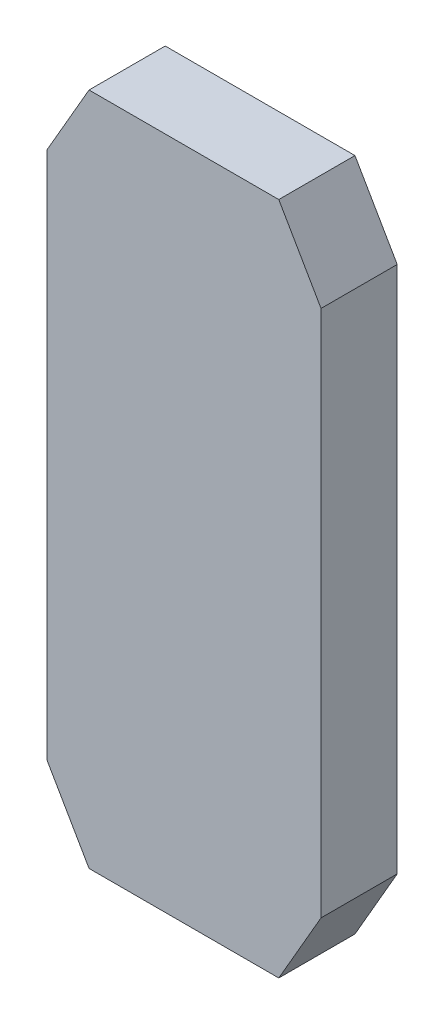
ISO-10303-21;
HEADER;
FILE_DESCRIPTION(('STEP AP214'),'2;1');
FILE_NAME('part.step','',(''),(''),'','','');
FILE_SCHEMA(('AUTOMOTIVE_DESIGN { 1 0 10303 214 1 1 1 1 }'));
ENDSEC;
DATA;
#1=APPLICATION_CONTEXT('core data for automotive mechanical design processes');
#2=APPLICATION_PROTOCOL_DEFINITION('international standard','automotive_design',2000,#1);
#3=PRODUCT_CONTEXT('',#1,'mechanical');
#4=PRODUCT('Part','Part','',(#3));
#5=PRODUCT_RELATED_PRODUCT_CATEGORY('part','',(#4));
#6=PRODUCT_DEFINITION_FORMATION('','',#4);
#7=PRODUCT_DEFINITION_CONTEXT('part definition',#1,'design');
#8=PRODUCT_DEFINITION('design','',#6,#7);
#9=PRODUCT_DEFINITION_SHAPE('','',#8);
#10=(LENGTH_UNIT() NAMED_UNIT(*) SI_UNIT(.MILLI.,.METRE.));
#11=(NAMED_UNIT(*) PLANE_ANGLE_UNIT() SI_UNIT($,.RADIAN.));
#12=(NAMED_UNIT(*) SI_UNIT($,.STERADIAN.) SOLID_ANGLE_UNIT());
#13=UNCERTAINTY_MEASURE_WITH_UNIT(LENGTH_MEASURE(1.E-05),#10,'distance_accuracy_value','');
#14=(GEOMETRIC_REPRESENTATION_CONTEXT(3) GLOBAL_UNCERTAINTY_ASSIGNED_CONTEXT((#13)) GLOBAL_UNIT_ASSIGNED_CONTEXT((#10,
#11,#12)) REPRESENTATION_CONTEXT('',''));
#15=CARTESIAN_POINT('',(0.,0.,0.));
#16=DIRECTION('',(0.,0.,1.));
#17=DIRECTION('',(1.,0.,0.));
#18=AXIS2_PLACEMENT_3D('',#15,#16,#17);
#19=CARTESIAN_POINT('',(-6.22649730810372,-22.1243556529822,-5.));
#20=DIRECTION('',(0.,-1.,0.));
#21=DIRECTION('',(0.,0.,-1.));
#22=AXIS2_PLACEMENT_3D('',#19,#20,#21);
#23=PLANE('',#22);
#24=DIRECTION('',(1.,0.,0.));
#25=VECTOR('',#24,1.);
#26=CARTESIAN_POINT('',(-6.22649730810372,-22.1243556529822,0.));
#27=LINE('',#26,#25);
#28=CARTESIAN_POINT('',(-6.22649730810372,-22.1243556529822,0.));
#29=VERTEX_POINT('',#28);
#30=CARTESIAN_POINT('',(6.22649730810374,-22.1243556529822,0.));
#31=VERTEX_POINT('',#30);
#32=EDGE_CURVE('E142',#29,#31,#27,.T.);
#33=ORIENTED_EDGE('',*,*,#32,.F.);
#34=DIRECTION('',(0.,0.,1.));
#35=VECTOR('',#34,1.);
#36=CARTESIAN_POINT('',(-6.22649730810372,-22.1243556529822,-5.));
#37=LINE('',#36,#35);
#38=CARTESIAN_POINT('',(-6.22649730810372,-22.1243556529822,-5.));
#39=VERTEX_POINT('',#38);
#40=EDGE_CURVE('E11',#39,#29,#37,.T.);
#41=ORIENTED_EDGE('',*,*,#40,.F.);
#42=DIRECTION('',(1.,0.,0.));
#43=VECTOR('',#42,1.);
#44=CARTESIAN_POINT('',(-6.22649730810372,-22.1243556529822,-5.));
#45=LINE('',#44,#43);
#46=CARTESIAN_POINT('',(6.22649730810374,-22.1243556529822,-5.));
#47=VERTEX_POINT('',#46);
#48=EDGE_CURVE('E163',#39,#47,#45,.T.);
#49=ORIENTED_EDGE('',*,*,#48,.T.);
#50=DIRECTION('',(0.,0.,1.));
#51=VECTOR('',#50,1.);
#52=CARTESIAN_POINT('',(6.22649730810374,-22.1243556529822,-5.));
#53=LINE('',#52,#51);
#54=EDGE_CURVE('E35',#47,#31,#53,.T.);
#55=ORIENTED_EDGE('',*,*,#54,.T.);
#56=EDGE_LOOP('',(#33,#41,#49,#55));
#57=FACE_BOUND('',#56,.T.);
#58=ADVANCED_FACE('F32',(#57),#23,.T.);
#59=CARTESIAN_POINT('',(-8.99999999999999,-17.3205080756888,-5.));
#60=DIRECTION('',(-0.86602540378444,-0.499999999999998,0.));
#61=DIRECTION('',(0.499999999999998,-0.86602540378444,0.));
#62=AXIS2_PLACEMENT_3D('',#59,#60,#61);
#63=PLANE('',#62);
#64=DIRECTION('',(0.499999999999998,-0.86602540378444,0.));
#65=VECTOR('',#64,1.);
#66=CARTESIAN_POINT('',(-8.99999999999999,-17.3205080756888,0.));
#67=LINE('',#66,#65);
#68=CARTESIAN_POINT('',(-8.99999999999999,-17.3205080756888,0.));
#69=VERTEX_POINT('',#68);
#70=EDGE_CURVE('E161',#69,#29,#67,.T.);
#71=ORIENTED_EDGE('',*,*,#70,.F.);
#72=DIRECTION('',(0.,0.,1.));
#73=VECTOR('',#72,1.);
#74=CARTESIAN_POINT('',(-8.99999999999999,-17.3205080756888,-5.));
#75=LINE('',#74,#73);
#76=CARTESIAN_POINT('',(-8.99999999999999,-17.3205080756888,-5.));
#77=VERTEX_POINT('',#76);
#78=EDGE_CURVE('E40',#77,#69,#75,.T.);
#79=ORIENTED_EDGE('',*,*,#78,.F.);
#80=DIRECTION('',(0.499999999999998,-0.86602540378444,0.));
#81=VECTOR('',#80,1.);
#82=CARTESIAN_POINT('',(-8.99999999999999,-17.3205080756888,-5.));
#83=LINE('',#82,#81);
#84=EDGE_CURVE('E132',#77,#39,#83,.T.);
#85=ORIENTED_EDGE('',*,*,#84,.T.);
#86=ORIENTED_EDGE('',*,*,#40,.T.);
#87=EDGE_LOOP('',(#71,#79,#85,#86));
#88=FACE_BOUND('',#87,.T.);
#89=ADVANCED_FACE('F175',(#88),#63,.T.);
#90=CARTESIAN_POINT('',(-8.99999999999999,17.3205080756888,-5.));
#91=DIRECTION('',(-1.,0.,0.));
#92=DIRECTION('',(0.,0.,1.));
#93=AXIS2_PLACEMENT_3D('',#90,#91,#92);
#94=PLANE('',#93);
#95=DIRECTION('',(0.,-1.,0.));
#96=VECTOR('',#95,1.);
#97=CARTESIAN_POINT('',(-8.99999999999999,17.3205080756888,0.));
#98=LINE('',#97,#96);
#99=CARTESIAN_POINT('',(-8.99999999999999,17.3205080756888,0.));
#100=VERTEX_POINT('',#99);
#101=EDGE_CURVE('E119',#100,#69,#98,.T.);
#102=ORIENTED_EDGE('',*,*,#101,.F.);
#103=DIRECTION('',(0.,0.,1.));
#104=VECTOR('',#103,1.);
#105=CARTESIAN_POINT('',(-8.99999999999999,17.3205080756888,-5.));
#106=LINE('',#105,#104);
#107=CARTESIAN_POINT('',(-8.99999999999999,17.3205080756888,-5.));
#108=VERTEX_POINT('',#107);
#109=EDGE_CURVE('E113',#108,#100,#106,.T.);
#110=ORIENTED_EDGE('',*,*,#109,.F.);
#111=DIRECTION('',(0.,-1.,0.));
#112=VECTOR('',#111,1.);
#113=CARTESIAN_POINT('',(-8.99999999999999,17.3205080756888,-5.));
#114=LINE('',#113,#112);
#115=EDGE_CURVE('E116',#108,#77,#114,.T.);
#116=ORIENTED_EDGE('',*,*,#115,.T.);
#117=ORIENTED_EDGE('',*,*,#78,.T.);
#118=EDGE_LOOP('',(#102,#110,#116,#117));
#119=FACE_BOUND('',#118,.T.);
#120=ADVANCED_FACE('F115',(#119),#94,.T.);
#121=CARTESIAN_POINT('',(-6.22649730810371,22.1243556529822,-5.));
#122=DIRECTION('',(-0.86602540378444,0.499999999999997,0.));
#123=DIRECTION('',(-0.499999999999997,-0.86602540378444,0.));
#124=AXIS2_PLACEMENT_3D('',#121,#122,#123);
#125=PLANE('',#124);
#126=DIRECTION('',(-0.499999999999997,-0.86602540378444,0.));
#127=VECTOR('',#126,1.);
#128=CARTESIAN_POINT('',(-6.22649730810371,22.1243556529822,0.));
#129=LINE('',#128,#127);
#130=CARTESIAN_POINT('',(-6.22649730810371,22.1243556529822,0.));
#131=VERTEX_POINT('',#130);
#132=EDGE_CURVE('E158',#131,#100,#129,.T.);
#133=ORIENTED_EDGE('',*,*,#132,.F.);
#134=DIRECTION('',(0.,0.,1.));
#135=VECTOR('',#134,1.);
#136=CARTESIAN_POINT('',(-6.22649730810371,22.1243556529822,-5.));
#137=LINE('',#136,#135);
#138=CARTESIAN_POINT('',(-6.22649730810371,22.1243556529822,-5.));
#139=VERTEX_POINT('',#138);
#140=EDGE_CURVE('E124',#139,#131,#137,.T.);
#141=ORIENTED_EDGE('',*,*,#140,.F.);
#142=DIRECTION('',(-0.499999999999997,-0.86602540378444,0.));
#143=VECTOR('',#142,1.);
#144=CARTESIAN_POINT('',(-6.22649730810371,22.1243556529822,-5.));
#145=LINE('',#144,#143);
#146=EDGE_CURVE('E130',#139,#108,#145,.T.);
#147=ORIENTED_EDGE('',*,*,#146,.T.);
#148=ORIENTED_EDGE('',*,*,#109,.T.);
#149=EDGE_LOOP('',(#133,#141,#147,#148));
#150=FACE_BOUND('',#149,.T.);
#151=ADVANCED_FACE('F134',(#150),#125,.T.);
#152=CARTESIAN_POINT('',(6.22649730810374,22.1243556529822,-5.));
#153=DIRECTION('',(0.,1.,0.));
#154=DIRECTION('',(-1.,0.,0.));
#155=AXIS2_PLACEMENT_3D('',#152,#153,#154);
#156=PLANE('',#155);
#157=DIRECTION('',(-1.,0.,0.));
#158=VECTOR('',#157,1.);
#159=CARTESIAN_POINT('',(6.22649730810374,22.1243556529822,0.));
#160=LINE('',#159,#158);
#161=CARTESIAN_POINT('',(6.22649730810374,22.1243556529822,0.));
#162=VERTEX_POINT('',#161);
#163=EDGE_CURVE('E155',#162,#131,#160,.T.);
#164=ORIENTED_EDGE('',*,*,#163,.F.);
#165=DIRECTION('',(0.,0.,1.));
#166=VECTOR('',#165,1.);
#167=CARTESIAN_POINT('',(6.22649730810374,22.1243556529822,-5.));
#168=LINE('',#167,#166);
#169=CARTESIAN_POINT('',(6.22649730810374,22.1243556529822,-5.));
#170=VERTEX_POINT('',#169);
#171=EDGE_CURVE('E167',#170,#162,#168,.T.);
#172=ORIENTED_EDGE('',*,*,#171,.F.);
#173=DIRECTION('',(-1.,0.,0.));
#174=VECTOR('',#173,1.);
#175=CARTESIAN_POINT('',(6.22649730810374,22.1243556529822,-5.));
#176=LINE('',#175,#174);
#177=EDGE_CURVE('E135',#170,#139,#176,.T.);
#178=ORIENTED_EDGE('',*,*,#177,.T.);
#179=ORIENTED_EDGE('',*,*,#140,.T.);
#180=EDGE_LOOP('',(#164,#172,#178,#179));
#181=FACE_BOUND('',#180,.T.);
#182=ADVANCED_FACE('F188',(#181),#156,.T.);
#183=CARTESIAN_POINT('',(9.00000000000001,17.3205080756888,-5.));
#184=DIRECTION('',(0.86602540378444,0.499999999999998,0.));
#185=DIRECTION('',(-0.499999999999998,0.86602540378444,0.));
#186=AXIS2_PLACEMENT_3D('',#183,#184,#185);
#187=PLANE('',#186);
#188=DIRECTION('',(-0.499999999999998,0.86602540378444,0.));
#189=VECTOR('',#188,1.);
#190=CARTESIAN_POINT('',(9.00000000000001,17.3205080756888,0.));
#191=LINE('',#190,#189);
#192=CARTESIAN_POINT('',(9.00000000000001,17.3205080756888,0.));
#193=VERTEX_POINT('',#192);
#194=EDGE_CURVE('E152',#193,#162,#191,.T.);
#195=ORIENTED_EDGE('',*,*,#194,.F.);
#196=DIRECTION('',(0.,0.,1.));
#197=VECTOR('',#196,1.);
#198=CARTESIAN_POINT('',(9.00000000000001,17.3205080756888,-5.));
#199=LINE('',#198,#197);
#200=CARTESIAN_POINT('',(9.00000000000001,17.3205080756888,-5.));
#201=VERTEX_POINT('',#200);
#202=EDGE_CURVE('E169',#201,#193,#199,.T.);
#203=ORIENTED_EDGE('',*,*,#202,.F.);
#204=DIRECTION('',(-0.499999999999998,0.86602540378444,0.));
#205=VECTOR('',#204,1.);
#206=CARTESIAN_POINT('',(9.00000000000001,17.3205080756888,-5.));
#207=LINE('',#206,#205);
#208=EDGE_CURVE('E137',#201,#170,#207,.T.);
#209=ORIENTED_EDGE('',*,*,#208,.T.);
#210=ORIENTED_EDGE('',*,*,#171,.T.);
#211=EDGE_LOOP('',(#195,#203,#209,#210));
#212=FACE_BOUND('',#211,.T.);
#213=ADVANCED_FACE('F191',(#212),#187,.T.);
#214=CARTESIAN_POINT('',(9.00000000000001,-17.3205080756888,-5.));
#215=DIRECTION('',(1.,0.,0.));
#216=DIRECTION('',(0.,1.,0.));
#217=AXIS2_PLACEMENT_3D('',#214,#215,#216);
#218=PLANE('',#217);
#219=DIRECTION('',(0.,1.,0.));
#220=VECTOR('',#219,1.);
#221=CARTESIAN_POINT('',(9.00000000000001,-17.3205080756888,0.));
#222=LINE('',#221,#220);
#223=CARTESIAN_POINT('',(9.00000000000001,-17.3205080756888,0.));
#224=VERTEX_POINT('',#223);
#225=EDGE_CURVE('E149',#224,#193,#222,.T.);
#226=ORIENTED_EDGE('',*,*,#225,.F.);
#227=DIRECTION('',(0.,0.,1.));
#228=VECTOR('',#227,1.);
#229=CARTESIAN_POINT('',(9.00000000000001,-17.3205080756888,-5.));
#230=LINE('',#229,#228);
#231=CARTESIAN_POINT('',(9.00000000000001,-17.3205080756888,-5.));
#232=VERTEX_POINT('',#231);
#233=EDGE_CURVE('E170',#232,#224,#230,.T.);
#234=ORIENTED_EDGE('',*,*,#233,.F.);
#235=DIRECTION('',(0.,1.,0.));
#236=VECTOR('',#235,1.);
#237=CARTESIAN_POINT('',(9.00000000000001,-17.3205080756888,-5.));
#238=LINE('',#237,#236);
#239=EDGE_CURVE('E327',#232,#201,#238,.T.);
#240=ORIENTED_EDGE('',*,*,#239,.T.);
#241=ORIENTED_EDGE('',*,*,#202,.T.);
#242=EDGE_LOOP('',(#226,#234,#240,#241));
#243=FACE_BOUND('',#242,.T.);
#244=ADVANCED_FACE('F195',(#243),#218,.T.);
#245=CARTESIAN_POINT('',(6.22649730810374,-22.1243556529822,-5.));
#246=DIRECTION('',(0.86602540378444,-0.499999999999998,0.));
#247=DIRECTION('',(0.499999999999998,0.86602540378444,0.));
#248=AXIS2_PLACEMENT_3D('',#245,#246,#247);
#249=PLANE('',#248);
#250=DIRECTION('',(0.499999999999998,0.86602540378444,0.));
#251=VECTOR('',#250,1.);
#252=CARTESIAN_POINT('',(6.22649730810374,-22.1243556529822,0.));
#253=LINE('',#252,#251);
#254=EDGE_CURVE('E145',#31,#224,#253,.T.);
#255=ORIENTED_EDGE('',*,*,#254,.F.);
#256=ORIENTED_EDGE('',*,*,#54,.F.);
#257=DIRECTION('',(0.499999999999998,0.86602540378444,0.));
#258=VECTOR('',#257,1.);
#259=CARTESIAN_POINT('',(6.22649730810374,-22.1243556529822,-5.));
#260=LINE('',#259,#258);
#261=EDGE_CURVE('E325',#47,#232,#260,.T.);
#262=ORIENTED_EDGE('',*,*,#261,.T.);
#263=ORIENTED_EDGE('',*,*,#233,.T.);
#264=EDGE_LOOP('',(#255,#256,#262,#263));
#265=FACE_BOUND('',#264,.T.);
#266=ADVANCED_FACE('F172',(#265),#249,.T.);
#267=CARTESIAN_POINT('',(0.,0.,-5.));
#268=DIRECTION('',(0.,0.,1.));
#269=DIRECTION('',(1.,0.,0.));
#270=AXIS2_PLACEMENT_3D('',#267,#268,#269);
#271=PLANE('',#270);
#272=DIRECTION('',(0.499999999999998,-0.86602540378444,0.));
#273=VECTOR('',#272,1.);
#274=CARTESIAN_POINT('',(-12.9509618943233,-7.47724133595212,-5.));
#275=LINE('',#274,#273);
#276=CARTESIAN_POINT('',(-7.49999999999999,-16.9185842870421,-5.));
#277=VERTEX_POINT('',#276);
#278=CARTESIAN_POINT('',(-5.36047190431927,-20.6243556529822,-5.));
#279=VERTEX_POINT('',#278);
#280=EDGE_CURVE('E272',#277,#279,#275,.T.);
#281=ORIENTED_EDGE('',*,*,#280,.T.);
#282=DIRECTION('',(1.,0.,0.));
#283=VECTOR('',#282,1.);
#284=CARTESIAN_POINT('',(0.,-20.6243556529822,-5.));
#285=LINE('',#284,#283);
#286=CARTESIAN_POINT('',(5.3604719043193,-20.6243556529822,-5.));
#287=VERTEX_POINT('',#286);
#288=EDGE_CURVE('E275',#279,#287,#285,.T.);
#289=ORIENTED_EDGE('',*,*,#288,.T.);
#290=DIRECTION('',(0.499999999999998,0.86602540378444,0.));
#291=VECTOR('',#290,1.);
#292=CARTESIAN_POINT('',(12.9509618943233,-7.47724133595212,-5.));
#293=LINE('',#292,#291);
#294=CARTESIAN_POINT('',(7.50000000000001,-16.9185842870421,-5.));
#295=VERTEX_POINT('',#294);
#296=EDGE_CURVE('E307',#287,#295,#293,.T.);
#297=ORIENTED_EDGE('',*,*,#296,.T.);
#298=DIRECTION('',(0.,1.,0.));
#299=VECTOR('',#298,1.);
#300=CARTESIAN_POINT('',(7.50000000000001,0.,-5.));
#301=LINE('',#300,#299);
#302=CARTESIAN_POINT('',(7.50000000000001,16.9185842870421,-5.));
#303=VERTEX_POINT('',#302);
#304=EDGE_CURVE('E48',#295,#303,#301,.T.);
#305=ORIENTED_EDGE('',*,*,#304,.T.);
#306=DIRECTION('',(-0.499999999999998,0.86602540378444,0.));
#307=VECTOR('',#306,1.);
#308=CARTESIAN_POINT('',(12.9509618943234,7.47724133595214,-5.));
#309=LINE('',#308,#307);
#310=CARTESIAN_POINT('',(5.3604719043193,20.6243556529822,-5.));
#311=VERTEX_POINT('',#310);
#312=EDGE_CURVE('E318',#303,#311,#309,.T.);
#313=ORIENTED_EDGE('',*,*,#312,.T.);
#314=DIRECTION('',(-1.,0.,0.));
#315=VECTOR('',#314,1.);
#316=CARTESIAN_POINT('',(0.,20.6243556529822,-5.));
#317=LINE('',#316,#315);
#318=CARTESIAN_POINT('',(-5.36047190431927,20.6243556529822,-5.));
#319=VERTEX_POINT('',#318);
#320=EDGE_CURVE('E315',#311,#319,#317,.T.);
#321=ORIENTED_EDGE('',*,*,#320,.T.);
#322=DIRECTION('',(-0.499999999999997,-0.86602540378444,0.));
#323=VECTOR('',#322,1.);
#324=CARTESIAN_POINT('',(-12.9509618943233,7.47724133595211,-5.));
#325=LINE('',#324,#323);
#326=CARTESIAN_POINT('',(-7.49999999999999,16.9185842870421,-5.));
#327=VERTEX_POINT('',#326);
#328=EDGE_CURVE('E312',#319,#327,#325,.T.);
#329=ORIENTED_EDGE('',*,*,#328,.T.);
#330=DIRECTION('',(0.,-1.,0.));
#331=VECTOR('',#330,1.);
#332=CARTESIAN_POINT('',(-7.49999999999999,0.,-5.));
#333=LINE('',#332,#331);
#334=EDGE_CURVE('E309',#327,#277,#333,.T.);
#335=ORIENTED_EDGE('',*,*,#334,.T.);
#336=EDGE_LOOP('',(#281,#289,#297,#305,#313,#321,#329,#335));
#337=FACE_BOUND('',#336,.T.);
#338=ORIENTED_EDGE('',*,*,#48,.F.);
#339=ORIENTED_EDGE('',*,*,#84,.F.);
#340=ORIENTED_EDGE('',*,*,#115,.F.);
#341=ORIENTED_EDGE('',*,*,#146,.F.);
#342=ORIENTED_EDGE('',*,*,#177,.F.);
#343=ORIENTED_EDGE('',*,*,#208,.F.);
#344=ORIENTED_EDGE('',*,*,#239,.F.);
#345=ORIENTED_EDGE('',*,*,#261,.F.);
#346=EDGE_LOOP('',(#338,#339,#340,#341,#342,#343,#344,#345));
#347=FACE_BOUND('',#346,.T.);
#348=ADVANCED_FACE('F128',(#337,#347),#271,.F.);
#349=CARTESIAN_POINT('',(0.,0.,0.));
#350=DIRECTION('',(0.,0.,1.));
#351=DIRECTION('',(1.,0.,0.));
#352=AXIS2_PLACEMENT_3D('',#349,#350,#351);
#353=PLANE('',#352);
#354=ORIENTED_EDGE('',*,*,#32,.T.);
#355=ORIENTED_EDGE('',*,*,#254,.T.);
#356=ORIENTED_EDGE('',*,*,#225,.T.);
#357=ORIENTED_EDGE('',*,*,#194,.T.);
#358=ORIENTED_EDGE('',*,*,#163,.T.);
#359=ORIENTED_EDGE('',*,*,#132,.T.);
#360=ORIENTED_EDGE('',*,*,#101,.T.);
#361=ORIENTED_EDGE('',*,*,#70,.T.);
#362=EDGE_LOOP('',(#354,#355,#356,#357,#358,#359,#360,#361));
#363=FACE_BOUND('',#362,.T.);
#364=ADVANCED_FACE('F174',(#363),#353,.T.);
#365=CARTESIAN_POINT('',(-6.22649730810372,-20.6243556529822,-5.));
#366=DIRECTION('',(0.,-1.,0.));
#367=DIRECTION('',(0.,0.,-1.));
#368=AXIS2_PLACEMENT_3D('',#365,#366,#367);
#369=PLANE('',#368);
#370=DIRECTION('',(1.,0.,0.));
#371=VECTOR('',#370,1.);
#372=CARTESIAN_POINT('',(0.,-20.6243556529822,-1.5));
#373=LINE('',#372,#371);
#374=CARTESIAN_POINT('',(-5.36047190431927,-20.6243556529822,-1.5));
#375=VERTEX_POINT('',#374);
#376=CARTESIAN_POINT('',(5.3604719043193,-20.6243556529822,-1.5));
#377=VERTEX_POINT('',#376);
#378=EDGE_CURVE('E250',#375,#377,#373,.T.);
#379=ORIENTED_EDGE('',*,*,#378,.T.);
#380=DIRECTION('',(0.,0.,1.));
#381=VECTOR('',#380,1.);
#382=CARTESIAN_POINT('',(5.3604719043193,-20.6243556529822,-5.));
#383=LINE('',#382,#381);
#384=EDGE_CURVE('E253',#287,#377,#383,.T.);
#385=ORIENTED_EDGE('',*,*,#384,.F.);
#386=ORIENTED_EDGE('',*,*,#288,.F.);
#387=DIRECTION('',(0.,0.,1.));
#388=VECTOR('',#387,1.);
#389=CARTESIAN_POINT('',(-5.36047190431927,-20.6243556529822,-5.));
#390=LINE('',#389,#388);
#391=EDGE_CURVE('E146',#279,#375,#390,.T.);
#392=ORIENTED_EDGE('',*,*,#391,.T.);
#393=EDGE_LOOP('',(#379,#385,#386,#392));
#394=FACE_BOUND('',#393,.T.);
#395=ADVANCED_FACE('F207',(#394),#369,.F.);
#396=CARTESIAN_POINT('',(-7.70096189432333,-16.5705080756888,-5.));
#397=DIRECTION('',(-0.86602540378444,-0.499999999999998,0.));
#398=DIRECTION('',(0.499999999999998,-0.86602540378444,0.));
#399=AXIS2_PLACEMENT_3D('',#396,#397,#398);
#400=PLANE('',#399);
#401=DIRECTION('',(0.499999999999998,-0.86602540378444,0.));
#402=VECTOR('',#401,1.);
#403=CARTESIAN_POINT('',(-12.9509618943233,-7.47724133595212,-1.5));
#404=LINE('',#403,#402);
#405=CARTESIAN_POINT('',(-7.49999999999999,-16.9185842870421,-1.5));
#406=VERTEX_POINT('',#405);
#407=EDGE_CURVE('E273',#406,#375,#404,.T.);
#408=ORIENTED_EDGE('',*,*,#407,.T.);
#409=ORIENTED_EDGE('',*,*,#391,.F.);
#410=ORIENTED_EDGE('',*,*,#280,.F.);
#411=DIRECTION('',(0.,0.,1.));
#412=VECTOR('',#411,1.);
#413=CARTESIAN_POINT('',(-7.49999999999999,-16.9185842870421,-5.));
#414=LINE('',#413,#412);
#415=EDGE_CURVE('E269',#277,#406,#414,.T.);
#416=ORIENTED_EDGE('',*,*,#415,.T.);
#417=EDGE_LOOP('',(#408,#409,#410,#416));
#418=FACE_BOUND('',#417,.T.);
#419=ADVANCED_FACE('F236',(#418),#400,.F.);
#420=CARTESIAN_POINT('',(-7.49999999999999,17.3205080756888,-5.));
#421=DIRECTION('',(-1.,0.,0.));
#422=DIRECTION('',(0.,0.,1.));
#423=AXIS2_PLACEMENT_3D('',#420,#421,#422);
#424=PLANE('',#423);
#425=DIRECTION('',(0.,-1.,0.));
#426=VECTOR('',#425,1.);
#427=CARTESIAN_POINT('',(-7.49999999999999,0.,-1.5));
#428=LINE('',#427,#426);
#429=CARTESIAN_POINT('',(-7.49999999999999,16.9185842870421,-1.5));
#430=VERTEX_POINT('',#429);
#431=EDGE_CURVE('E276',#430,#406,#428,.T.);
#432=ORIENTED_EDGE('',*,*,#431,.T.);
#433=ORIENTED_EDGE('',*,*,#415,.F.);
#434=ORIENTED_EDGE('',*,*,#334,.F.);
#435=DIRECTION('',(0.,0.,1.));
#436=VECTOR('',#435,1.);
#437=CARTESIAN_POINT('',(-7.49999999999999,16.9185842870421,-5.));
#438=LINE('',#437,#436);
#439=EDGE_CURVE('E279',#327,#430,#438,.T.);
#440=ORIENTED_EDGE('',*,*,#439,.T.);
#441=EDGE_LOOP('',(#432,#433,#434,#440));
#442=FACE_BOUND('',#441,.T.);
#443=ADVANCED_FACE('F232',(#442),#424,.F.);
#444=CARTESIAN_POINT('',(-4.92745920242705,21.3743556529822,-5.));
#445=DIRECTION('',(-0.86602540378444,0.499999999999997,0.));
#446=DIRECTION('',(-0.499999999999997,-0.86602540378444,0.));
#447=AXIS2_PLACEMENT_3D('',#444,#445,#446);
#448=PLANE('',#447);
#449=DIRECTION('',(-0.499999999999997,-0.86602540378444,0.));
#450=VECTOR('',#449,1.);
#451=CARTESIAN_POINT('',(-12.9509618943233,7.47724133595211,-1.5));
#452=LINE('',#451,#450);
#453=CARTESIAN_POINT('',(-5.36047190431927,20.6243556529822,-1.5));
#454=VERTEX_POINT('',#453);
#455=EDGE_CURVE('E282',#454,#430,#452,.T.);
#456=ORIENTED_EDGE('',*,*,#455,.T.);
#457=ORIENTED_EDGE('',*,*,#439,.F.);
#458=ORIENTED_EDGE('',*,*,#328,.F.);
#459=DIRECTION('',(0.,0.,1.));
#460=VECTOR('',#459,1.);
#461=CARTESIAN_POINT('',(-5.36047190431927,20.6243556529822,-5.));
#462=LINE('',#461,#460);
#463=EDGE_CURVE('E285',#319,#454,#462,.T.);
#464=ORIENTED_EDGE('',*,*,#463,.T.);
#465=EDGE_LOOP('',(#456,#457,#458,#464));
#466=FACE_BOUND('',#465,.T.);
#467=ADVANCED_FACE('F228',(#466),#448,.F.);
#468=CARTESIAN_POINT('',(6.22649730810374,20.6243556529822,-5.));
#469=DIRECTION('',(0.,1.,0.));
#470=DIRECTION('',(-1.,0.,0.));
#471=AXIS2_PLACEMENT_3D('',#468,#469,#470);
#472=PLANE('',#471);
#473=DIRECTION('',(-1.,0.,0.));
#474=VECTOR('',#473,1.);
#475=CARTESIAN_POINT('',(0.,20.6243556529822,-1.5));
#476=LINE('',#475,#474);
#477=CARTESIAN_POINT('',(5.3604719043193,20.6243556529822,-1.5));
#478=VERTEX_POINT('',#477);
#479=EDGE_CURVE('E288',#478,#454,#476,.T.);
#480=ORIENTED_EDGE('',*,*,#479,.T.);
#481=ORIENTED_EDGE('',*,*,#463,.F.);
#482=ORIENTED_EDGE('',*,*,#320,.F.);
#483=DIRECTION('',(0.,0.,1.));
#484=VECTOR('',#483,1.);
#485=CARTESIAN_POINT('',(5.3604719043193,20.6243556529822,-5.));
#486=LINE('',#485,#484);
#487=EDGE_CURVE('E291',#311,#478,#486,.T.);
#488=ORIENTED_EDGE('',*,*,#487,.T.);
#489=EDGE_LOOP('',(#480,#481,#482,#488));
#490=FACE_BOUND('',#489,.T.);
#491=ADVANCED_FACE('F224',(#490),#472,.F.);
#492=CARTESIAN_POINT('',(7.70096189432335,16.5705080756888,-5.));
#493=DIRECTION('',(0.86602540378444,0.499999999999998,0.));
#494=DIRECTION('',(-0.499999999999998,0.86602540378444,0.));
#495=AXIS2_PLACEMENT_3D('',#492,#493,#494);
#496=PLANE('',#495);
#497=DIRECTION('',(-0.499999999999998,0.86602540378444,0.));
#498=VECTOR('',#497,1.);
#499=CARTESIAN_POINT('',(12.9509618943234,7.47724133595214,-1.5));
#500=LINE('',#499,#498);
#501=CARTESIAN_POINT('',(7.50000000000001,16.9185842870421,-1.5));
#502=VERTEX_POINT('',#501);
#503=EDGE_CURVE('E294',#502,#478,#500,.T.);
#504=ORIENTED_EDGE('',*,*,#503,.T.);
#505=ORIENTED_EDGE('',*,*,#487,.F.);
#506=ORIENTED_EDGE('',*,*,#312,.F.);
#507=DIRECTION('',(0.,0.,1.));
#508=VECTOR('',#507,1.);
#509=CARTESIAN_POINT('',(7.50000000000001,16.9185842870421,-5.));
#510=LINE('',#509,#508);
#511=EDGE_CURVE('E297',#303,#502,#510,.T.);
#512=ORIENTED_EDGE('',*,*,#511,.T.);
#513=EDGE_LOOP('',(#504,#505,#506,#512));
#514=FACE_BOUND('',#513,.T.);
#515=ADVANCED_FACE('F221',(#514),#496,.F.);
#516=CARTESIAN_POINT('',(7.50000000000001,-17.3205080756888,-5.));
#517=DIRECTION('',(1.,0.,0.));
#518=DIRECTION('',(0.,1.,0.));
#519=AXIS2_PLACEMENT_3D('',#516,#517,#518);
#520=PLANE('',#519);
#521=DIRECTION('',(0.,1.,0.));
#522=VECTOR('',#521,1.);
#523=CARTESIAN_POINT('',(7.50000000000001,0.,-1.5));
#524=LINE('',#523,#522);
#525=CARTESIAN_POINT('',(7.50000000000001,-16.9185842870421,-1.5));
#526=VERTEX_POINT('',#525);
#527=EDGE_CURVE('E265',#526,#502,#524,.T.);
#528=ORIENTED_EDGE('',*,*,#527,.T.);
#529=ORIENTED_EDGE('',*,*,#511,.F.);
#530=ORIENTED_EDGE('',*,*,#304,.F.);
#531=DIRECTION('',(0.,0.,1.));
#532=VECTOR('',#531,1.);
#533=CARTESIAN_POINT('',(7.50000000000001,-16.9185842870421,-5.));
#534=LINE('',#533,#532);
#535=EDGE_CURVE('E271',#295,#526,#534,.T.);
#536=ORIENTED_EDGE('',*,*,#535,.T.);
#537=EDGE_LOOP('',(#528,#529,#530,#536));
#538=FACE_BOUND('',#537,.T.);
#539=ADVANCED_FACE('F217',(#538),#520,.F.);
#540=CARTESIAN_POINT('',(4.92745920242708,-21.3743556529822,-5.));
#541=DIRECTION('',(0.86602540378444,-0.499999999999998,0.));
#542=DIRECTION('',(0.499999999999998,0.86602540378444,0.));
#543=AXIS2_PLACEMENT_3D('',#540,#541,#542);
#544=PLANE('',#543);
#545=DIRECTION('',(0.499999999999998,0.86602540378444,0.));
#546=VECTOR('',#545,1.);
#547=CARTESIAN_POINT('',(12.9509618943233,-7.47724133595212,-1.5));
#548=LINE('',#547,#546);
#549=EDGE_CURVE('E262',#377,#526,#548,.T.);
#550=ORIENTED_EDGE('',*,*,#549,.T.);
#551=ORIENTED_EDGE('',*,*,#535,.F.);
#552=ORIENTED_EDGE('',*,*,#296,.F.);
#553=ORIENTED_EDGE('',*,*,#384,.T.);
#554=EDGE_LOOP('',(#550,#551,#552,#553));
#555=FACE_BOUND('',#554,.T.);
#556=ADVANCED_FACE('F213',(#555),#544,.F.);
#557=CARTESIAN_POINT('',(0.,0.,-1.5));
#558=DIRECTION('',(0.,0.,1.));
#559=DIRECTION('',(1.,0.,0.));
#560=AXIS2_PLACEMENT_3D('',#557,#558,#559);
#561=PLANE('',#560);
#562=ORIENTED_EDGE('',*,*,#378,.F.);
#563=ORIENTED_EDGE('',*,*,#407,.F.);
#564=ORIENTED_EDGE('',*,*,#431,.F.);
#565=ORIENTED_EDGE('',*,*,#455,.F.);
#566=ORIENTED_EDGE('',*,*,#479,.F.);
#567=ORIENTED_EDGE('',*,*,#503,.F.);
#568=ORIENTED_EDGE('',*,*,#527,.F.);
#569=ORIENTED_EDGE('',*,*,#549,.F.);
#570=EDGE_LOOP('',(#562,#563,#564,#565,#566,#567,#568,#569));
#571=FACE_BOUND('',#570,.T.);
#572=ADVANCED_FACE('F210',(#571),#561,.F.);
#573=CLOSED_SHELL('',(#58,#89,#120,#151,#182,#213,#244,#266,#348,#364,#395,#419,#443,#467,#491,
#515,#539,#556,#572));
#574=MANIFOLD_SOLID_BREP('B2',#573);
#575=ADVANCED_BREP_SHAPE_REPRESENTATION('',(#18,#574),#14);
#576=SHAPE_DEFINITION_REPRESENTATION(#9,#575);
ENDSEC;
END-ISO-10303-21;
